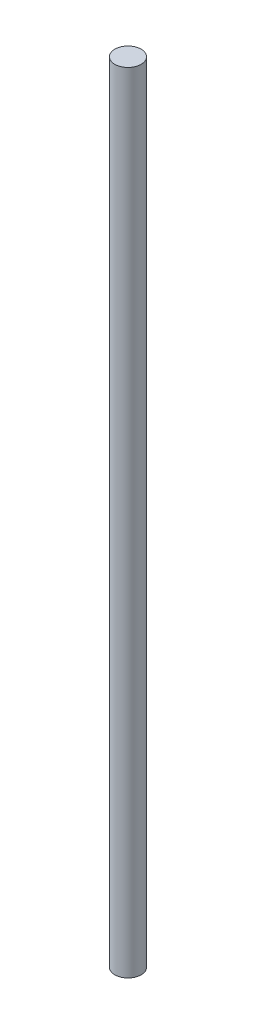
ISO-10303-21;
HEADER;
FILE_DESCRIPTION(('STEP AP214'),'2;1');
FILE_NAME('part.step','',(''),(''),'','','');
FILE_SCHEMA(('AUTOMOTIVE_DESIGN { 1 0 10303 214 1 1 1 1 }'));
ENDSEC;
DATA;
#1=APPLICATION_CONTEXT('core data for automotive mechanical design processes');
#2=APPLICATION_PROTOCOL_DEFINITION('international standard','automotive_design',2000,#1);
#3=PRODUCT_CONTEXT('',#1,'mechanical');
#4=PRODUCT('Part','Part','',(#3));
#5=PRODUCT_RELATED_PRODUCT_CATEGORY('part','',(#4));
#6=PRODUCT_DEFINITION_FORMATION('','',#4);
#7=PRODUCT_DEFINITION_CONTEXT('part definition',#1,'design');
#8=PRODUCT_DEFINITION('design','',#6,#7);
#9=PRODUCT_DEFINITION_SHAPE('','',#8);
#10=(LENGTH_UNIT() NAMED_UNIT(*) SI_UNIT(.MILLI.,.METRE.));
#11=(NAMED_UNIT(*) PLANE_ANGLE_UNIT() SI_UNIT($,.RADIAN.));
#12=(NAMED_UNIT(*) SI_UNIT($,.STERADIAN.) SOLID_ANGLE_UNIT());
#13=UNCERTAINTY_MEASURE_WITH_UNIT(LENGTH_MEASURE(1.E-05),#10,'distance_accuracy_value','');
#14=(GEOMETRIC_REPRESENTATION_CONTEXT(3) GLOBAL_UNCERTAINTY_ASSIGNED_CONTEXT((#13)) GLOBAL_UNIT_ASSIGNED_CONTEXT((#10,
#11,#12)) REPRESENTATION_CONTEXT('',''));
#15=CARTESIAN_POINT('',(0.,0.,0.));
#16=DIRECTION('',(0.,0.,1.));
#17=DIRECTION('',(1.,0.,0.));
#18=AXIS2_PLACEMENT_3D('',#15,#16,#17);
#19=CARTESIAN_POINT('',(0.,60.,0.));
#20=DIRECTION('',(0.,-1.,0.));
#21=DIRECTION('',(0.,0.,-1.));
#22=AXIS2_PLACEMENT_3D('',#19,#20,#21);
#23=CYLINDRICAL_SURFACE('',#22,1.);
#24=CARTESIAN_POINT('',(0.,60.,0.));
#25=DIRECTION('',(0.,1.,0.));
#26=DIRECTION('',(0.,0.,1.));
#27=AXIS2_PLACEMENT_3D('',#24,#25,#26);
#28=CIRCLE('',#27,1.);
#29=CARTESIAN_POINT('',(0.,60.,1.));
#30=VERTEX_POINT('',#29);
#31=EDGE_CURVE('E10',#30,#30,#28,.T.);
#32=ORIENTED_EDGE('',*,*,#31,.F.);
#33=EDGE_LOOP('',(#32));
#34=FACE_BOUND('',#33,.T.);
#35=CARTESIAN_POINT('',(0.,0.,0.));
#36=DIRECTION('',(0.,1.,0.));
#37=DIRECTION('',(0.,0.,1.));
#38=AXIS2_PLACEMENT_3D('',#35,#36,#37);
#39=CIRCLE('',#38,1.);
#40=CARTESIAN_POINT('',(0.,0.,1.));
#41=VERTEX_POINT('',#40);
#42=EDGE_CURVE('E46',#41,#41,#39,.T.);
#43=ORIENTED_EDGE('',*,*,#42,.T.);
#44=EDGE_LOOP('',(#43));
#45=FACE_BOUND('',#44,.T.);
#46=ADVANCED_FACE('F43',(#34,#45),#23,.T.);
#47=CARTESIAN_POINT('',(0.,60.,0.));
#48=DIRECTION('',(0.,1.,0.));
#49=DIRECTION('',(0.,0.,1.));
#50=AXIS2_PLACEMENT_3D('',#47,#48,#49);
#51=PLANE('',#50);
#52=ORIENTED_EDGE('',*,*,#31,.T.);
#53=EDGE_LOOP('',(#52));
#54=FACE_BOUND('',#53,.T.);
#55=ADVANCED_FACE('F60',(#54),#51,.T.);
#56=CARTESIAN_POINT('',(0.,0.,0.));
#57=DIRECTION('',(0.,1.,0.));
#58=DIRECTION('',(0.,0.,1.));
#59=AXIS2_PLACEMENT_3D('',#56,#57,#58);
#60=PLANE('',#59);
#61=ORIENTED_EDGE('',*,*,#42,.F.);
#62=EDGE_LOOP('',(#61));
#63=FACE_BOUND('',#62,.T.);
#64=ADVANCED_FACE('F58',(#63),#60,.F.);
#65=CLOSED_SHELL('',(#46,#55,#64));
#66=MANIFOLD_SOLID_BREP('B2',#65);
#67=ADVANCED_BREP_SHAPE_REPRESENTATION('',(#18,#66),#14);
#68=SHAPE_DEFINITION_REPRESENTATION(#9,#67);
ENDSEC;
END-ISO-10303-21;
